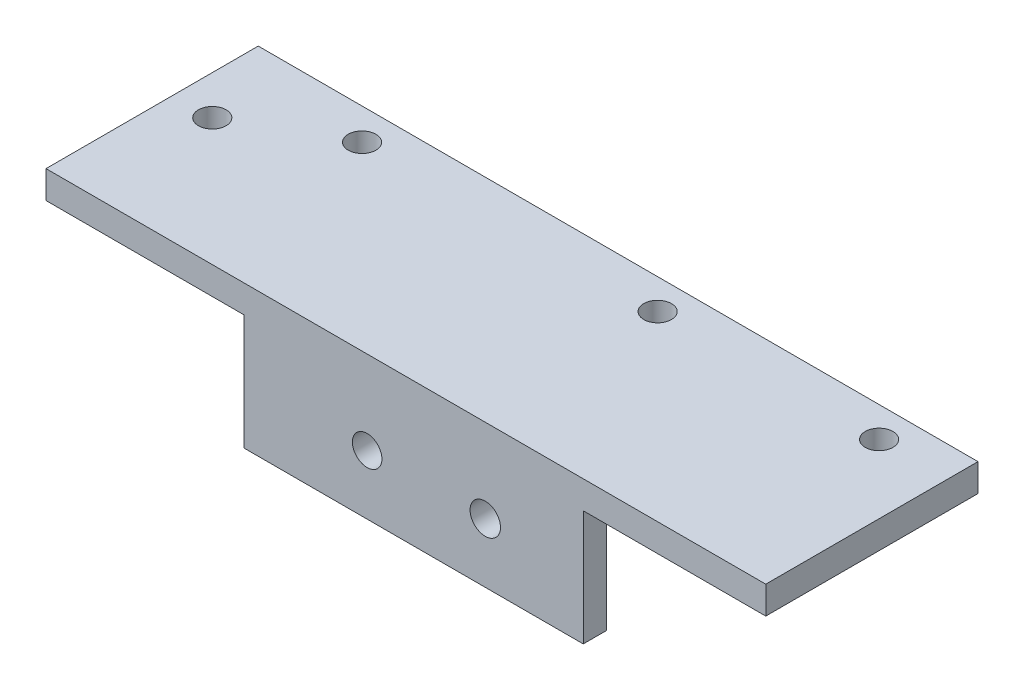
ISO-10303-21;
HEADER;
FILE_DESCRIPTION(('STEP AP214'),'2;1');
FILE_NAME('part.step','',(''),(''),'','','');
FILE_SCHEMA(('AUTOMOTIVE_DESIGN { 1 0 10303 214 1 1 1 1 }'));
ENDSEC;
DATA;
#1=APPLICATION_CONTEXT('core data for automotive mechanical design processes');
#2=APPLICATION_PROTOCOL_DEFINITION('international standard','automotive_design',2000,#1);
#3=PRODUCT_CONTEXT('',#1,'mechanical');
#4=PRODUCT('Part','Part','',(#3));
#5=PRODUCT_RELATED_PRODUCT_CATEGORY('part','',(#4));
#6=PRODUCT_DEFINITION_FORMATION('','',#4);
#7=PRODUCT_DEFINITION_CONTEXT('part definition',#1,'design');
#8=PRODUCT_DEFINITION('design','',#6,#7);
#9=PRODUCT_DEFINITION_SHAPE('','',#8);
#10=(LENGTH_UNIT() NAMED_UNIT(*) SI_UNIT(.MILLI.,.METRE.));
#11=(NAMED_UNIT(*) PLANE_ANGLE_UNIT() SI_UNIT($,.RADIAN.));
#12=(NAMED_UNIT(*) SI_UNIT($,.STERADIAN.) SOLID_ANGLE_UNIT());
#13=UNCERTAINTY_MEASURE_WITH_UNIT(LENGTH_MEASURE(1.E-05),#10,'distance_accuracy_value','');
#14=(GEOMETRIC_REPRESENTATION_CONTEXT(3) GLOBAL_UNCERTAINTY_ASSIGNED_CONTEXT((#13)) GLOBAL_UNIT_ASSIGNED_CONTEXT((#10,
#11,#12)) REPRESENTATION_CONTEXT('',''));
#15=CARTESIAN_POINT('',(0.,0.,0.));
#16=DIRECTION('',(0.,0.,1.));
#17=DIRECTION('',(1.,0.,0.));
#18=AXIS2_PLACEMENT_3D('',#15,#16,#17);
#19=CARTESIAN_POINT('',(0.,0.,0.));
#20=DIRECTION('',(0.,1.,0.));
#21=DIRECTION('',(0.,0.,1.));
#22=AXIS2_PLACEMENT_3D('',#19,#20,#21);
#23=PLANE('',#22);
#24=CARTESIAN_POINT('',(-24.35,0.,-4.1));
#25=DIRECTION('',(0.,1.,0.));
#26=DIRECTION('',(0.,0.,1.));
#27=AXIS2_PLACEMENT_3D('',#24,#25,#26);
#28=CIRCLE('',#27,1.5);
#29=CARTESIAN_POINT('',(-24.35,0.,-2.6));
#30=VERTEX_POINT('',#29);
#31=EDGE_CURVE('E178',#30,#30,#28,.T.);
#32=ORIENTED_EDGE('',*,*,#31,.T.);
#33=EDGE_LOOP('',(#32));
#34=FACE_BOUND('',#33,.T.);
#35=CARTESIAN_POINT('',(31.56,0.,-4.22169208076263));
#36=DIRECTION('',(0.,1.,0.));
#37=DIRECTION('',(0.,0.,1.));
#38=AXIS2_PLACEMENT_3D('',#35,#36,#37);
#39=CIRCLE('',#38,1.5);
#40=CARTESIAN_POINT('',(31.56,0.,-2.72169208076263));
#41=VERTEX_POINT('',#40);
#42=EDGE_CURVE('E171',#41,#41,#39,.T.);
#43=ORIENTED_EDGE('',*,*,#42,.T.);
#44=EDGE_LOOP('',(#43));
#45=FACE_BOUND('',#44,.T.);
#46=CARTESIAN_POINT('',(7.56,0.,-4.22169208076263));
#47=DIRECTION('',(0.,1.,0.));
#48=DIRECTION('',(0.,0.,1.));
#49=AXIS2_PLACEMENT_3D('',#46,#47,#48);
#50=CIRCLE('',#49,1.5);
#51=CARTESIAN_POINT('',(7.56,0.,-2.72169208076263));
#52=VERTEX_POINT('',#51);
#53=EDGE_CURVE('E153',#52,#52,#50,.T.);
#54=ORIENTED_EDGE('',*,*,#53,.T.);
#55=EDGE_LOOP('',(#54));
#56=FACE_BOUND('',#55,.T.);
#57=CARTESIAN_POINT('',(-34.76,0.,1.72));
#58=DIRECTION('',(0.,1.,0.));
#59=DIRECTION('',(0.,0.,1.));
#60=AXIS2_PLACEMENT_3D('',#57,#58,#59);
#61=CIRCLE('',#60,1.5);
#62=CARTESIAN_POINT('',(-34.76,0.,3.22));
#63=VERTEX_POINT('',#62);
#64=EDGE_CURVE('E157',#63,#63,#61,.T.);
#65=ORIENTED_EDGE('',*,*,#64,.T.);
#66=EDGE_LOOP('',(#65));
#67=FACE_BOUND('',#66,.T.);
#68=DIRECTION('',(0.,0.,-1.));
#69=VECTOR('',#68,1.);
#70=CARTESIAN_POINT('',(-17.5447148574661,0.,15.5));
#71=LINE('',#70,#69);
#72=CARTESIAN_POINT('',(-17.5447148574661,0.,15.5));
#73=VERTEX_POINT('',#72);
#74=CARTESIAN_POINT('',(-17.5447148574661,0.,13.));
#75=VERTEX_POINT('',#74);
#76=EDGE_CURVE('E66',#73,#75,#71,.T.);
#77=ORIENTED_EDGE('',*,*,#76,.F.);
#78=DIRECTION('',(-1.,0.,0.));
#79=VECTOR('',#78,1.);
#80=CARTESIAN_POINT('',(-39.,0.,15.5));
#81=LINE('',#80,#79);
#82=CARTESIAN_POINT('',(-39.,0.,15.5));
#83=VERTEX_POINT('',#82);
#84=EDGE_CURVE('E133',#73,#83,#81,.T.);
#85=ORIENTED_EDGE('',*,*,#84,.T.);
#86=DIRECTION('',(0.,0.,-1.));
#87=VECTOR('',#86,1.);
#88=CARTESIAN_POINT('',(-39.,0.,7.5));
#89=LINE('',#88,#87);
#90=CARTESIAN_POINT('',(-39.,0.,-7.5));
#91=VERTEX_POINT('',#90);
#92=EDGE_CURVE('E193',#83,#91,#89,.T.);
#93=ORIENTED_EDGE('',*,*,#92,.T.);
#94=DIRECTION('',(1.,0.,0.));
#95=VECTOR('',#94,1.);
#96=CARTESIAN_POINT('',(-39.,0.,-7.5));
#97=LINE('',#96,#95);
#98=CARTESIAN_POINT('',(39.,0.,-7.5));
#99=VERTEX_POINT('',#98);
#100=EDGE_CURVE('E161',#91,#99,#97,.T.);
#101=ORIENTED_EDGE('',*,*,#100,.T.);
#102=DIRECTION('',(0.,0.,-1.));
#103=VECTOR('',#102,1.);
#104=CARTESIAN_POINT('',(39.,0.,7.5));
#105=LINE('',#104,#103);
#106=CARTESIAN_POINT('',(39.,0.,15.5));
#107=VERTEX_POINT('',#106);
#108=EDGE_CURVE('E204',#107,#99,#105,.T.);
#109=ORIENTED_EDGE('',*,*,#108,.F.);
#110=CARTESIAN_POINT('',(19.2231892448185,0.,15.5));
#111=VERTEX_POINT('',#110);
#112=EDGE_CURVE('E137',#107,#111,#81,.T.);
#113=ORIENTED_EDGE('',*,*,#112,.T.);
#114=DIRECTION('',(0.,0.,1.));
#115=VECTOR('',#114,1.);
#116=CARTESIAN_POINT('',(19.2231892448185,0.,15.5));
#117=LINE('',#116,#115);
#118=CARTESIAN_POINT('',(19.2231892448185,0.,13.));
#119=VERTEX_POINT('',#118);
#120=EDGE_CURVE('E129',#119,#111,#117,.T.);
#121=ORIENTED_EDGE('',*,*,#120,.F.);
#122=DIRECTION('',(1.,0.,0.));
#123=VECTOR('',#122,1.);
#124=CARTESIAN_POINT('',(-17.5447148574661,0.,13.));
#125=LINE('',#124,#123);
#126=EDGE_CURVE('E61',#75,#119,#125,.T.);
#127=ORIENTED_EDGE('',*,*,#126,.F.);
#128=EDGE_LOOP('',(#77,#85,#93,#101,#109,#113,#121,#127));
#129=FACE_BOUND('',#128,.T.);
#130=ADVANCED_FACE('F45',(#34,#45,#56,#67,#129),#23,.F.);
#131=CARTESIAN_POINT('',(-39.,3.,-7.5));
#132=DIRECTION('',(0.,0.,-1.));
#133=DIRECTION('',(-1.,0.,0.));
#134=AXIS2_PLACEMENT_3D('',#131,#132,#133);
#135=PLANE('',#134);
#136=ORIENTED_EDGE('',*,*,#100,.F.);
#137=DIRECTION('',(0.,-1.,0.));
#138=VECTOR('',#137,1.);
#139=CARTESIAN_POINT('',(-39.,3.,-7.5));
#140=LINE('',#139,#138);
#141=CARTESIAN_POINT('',(-39.,3.,-7.5));
#142=VERTEX_POINT('',#141);
#143=EDGE_CURVE('E11',#142,#91,#140,.T.);
#144=ORIENTED_EDGE('',*,*,#143,.F.);
#145=DIRECTION('',(1.,0.,0.));
#146=VECTOR('',#145,1.);
#147=CARTESIAN_POINT('',(-39.,3.,-7.5));
#148=LINE('',#147,#146);
#149=CARTESIAN_POINT('',(39.,3.,-7.5));
#150=VERTEX_POINT('',#149);
#151=EDGE_CURVE('E189',#142,#150,#148,.T.);
#152=ORIENTED_EDGE('',*,*,#151,.T.);
#153=DIRECTION('',(0.,-1.,0.));
#154=VECTOR('',#153,1.);
#155=CARTESIAN_POINT('',(39.,3.,-7.5));
#156=LINE('',#155,#154);
#157=EDGE_CURVE('E49',#150,#99,#156,.T.);
#158=ORIENTED_EDGE('',*,*,#157,.T.);
#159=EDGE_LOOP('',(#136,#144,#152,#158));
#160=FACE_BOUND('',#159,.T.);
#161=ADVANCED_FACE('F47',(#160),#135,.T.);
#162=CARTESIAN_POINT('',(-39.,3.,7.5));
#163=DIRECTION('',(-1.,0.,0.));
#164=DIRECTION('',(0.,0.,1.));
#165=AXIS2_PLACEMENT_3D('',#162,#163,#164);
#166=PLANE('',#165);
#167=ORIENTED_EDGE('',*,*,#92,.F.);
#168=DIRECTION('',(0.,-1.,0.));
#169=VECTOR('',#168,1.);
#170=CARTESIAN_POINT('',(-39.,3.,15.5));
#171=LINE('',#170,#169);
#172=CARTESIAN_POINT('',(-39.,3.,15.5));
#173=VERTEX_POINT('',#172);
#174=EDGE_CURVE('E149',#173,#83,#171,.T.);
#175=ORIENTED_EDGE('',*,*,#174,.F.);
#176=DIRECTION('',(0.,0.,-1.));
#177=VECTOR('',#176,1.);
#178=CARTESIAN_POINT('',(-39.,3.,7.5));
#179=LINE('',#178,#177);
#180=EDGE_CURVE('E197',#173,#142,#179,.T.);
#181=ORIENTED_EDGE('',*,*,#180,.T.);
#182=ORIENTED_EDGE('',*,*,#143,.T.);
#183=EDGE_LOOP('',(#167,#175,#181,#182));
#184=FACE_BOUND('',#183,.T.);
#185=ADVANCED_FACE('F214',(#184),#166,.T.);
#186=CARTESIAN_POINT('',(39.,3.,7.5));
#187=DIRECTION('',(-1.,0.,0.));
#188=DIRECTION('',(0.,0.,1.));
#189=AXIS2_PLACEMENT_3D('',#186,#187,#188);
#190=PLANE('',#189);
#191=ORIENTED_EDGE('',*,*,#108,.T.);
#192=ORIENTED_EDGE('',*,*,#157,.F.);
#193=DIRECTION('',(0.,0.,-1.));
#194=VECTOR('',#193,1.);
#195=CARTESIAN_POINT('',(39.,3.,7.5));
#196=LINE('',#195,#194);
#197=CARTESIAN_POINT('',(39.,3.,15.5));
#198=VERTEX_POINT('',#197);
#199=EDGE_CURVE('E192',#198,#150,#196,.T.);
#200=ORIENTED_EDGE('',*,*,#199,.F.);
#201=DIRECTION('',(0.,-1.,0.));
#202=VECTOR('',#201,1.);
#203=CARTESIAN_POINT('',(39.,3.,15.5));
#204=LINE('',#203,#202);
#205=EDGE_CURVE('E146',#198,#107,#204,.T.);
#206=ORIENTED_EDGE('',*,*,#205,.T.);
#207=EDGE_LOOP('',(#191,#192,#200,#206));
#208=FACE_BOUND('',#207,.T.);
#209=ADVANCED_FACE('F228',(#208),#190,.F.);
#210=CARTESIAN_POINT('',(0.,3.,0.));
#211=DIRECTION('',(0.,1.,0.));
#212=DIRECTION('',(0.,0.,1.));
#213=AXIS2_PLACEMENT_3D('',#210,#211,#212);
#214=PLANE('',#213);
#215=CARTESIAN_POINT('',(7.56,3.,-4.22169208076263));
#216=DIRECTION('',(0.,1.,0.));
#217=DIRECTION('',(0.,0.,1.));
#218=AXIS2_PLACEMENT_3D('',#215,#216,#217);
#219=CIRCLE('',#218,1.5);
#220=CARTESIAN_POINT('',(7.56,3.,-2.72169208076263));
#221=VERTEX_POINT('',#220);
#222=EDGE_CURVE('E167',#221,#221,#219,.T.);
#223=ORIENTED_EDGE('',*,*,#222,.F.);
#224=EDGE_LOOP('',(#223));
#225=FACE_BOUND('',#224,.T.);
#226=ORIENTED_EDGE('',*,*,#180,.F.);
#227=DIRECTION('',(-1.,0.,0.));
#228=VECTOR('',#227,1.);
#229=CARTESIAN_POINT('',(-39.,3.,15.5));
#230=LINE('',#229,#228);
#231=EDGE_CURVE('E143',#198,#173,#230,.T.);
#232=ORIENTED_EDGE('',*,*,#231,.F.);
#233=ORIENTED_EDGE('',*,*,#199,.T.);
#234=ORIENTED_EDGE('',*,*,#151,.F.);
#235=EDGE_LOOP('',(#226,#232,#233,#234));
#236=FACE_BOUND('',#235,.T.);
#237=CARTESIAN_POINT('',(-34.76,3.,1.72));
#238=DIRECTION('',(0.,1.,0.));
#239=DIRECTION('',(0.,0.,1.));
#240=AXIS2_PLACEMENT_3D('',#237,#238,#239);
#241=CIRCLE('',#240,1.5);
#242=CARTESIAN_POINT('',(-34.76,3.,3.22));
#243=VERTEX_POINT('',#242);
#244=EDGE_CURVE('E162',#243,#243,#241,.T.);
#245=ORIENTED_EDGE('',*,*,#244,.F.);
#246=EDGE_LOOP('',(#245));
#247=FACE_BOUND('',#246,.T.);
#248=CARTESIAN_POINT('',(-24.35,3.,-4.1));
#249=DIRECTION('',(0.,1.,0.));
#250=DIRECTION('',(0.,0.,1.));
#251=AXIS2_PLACEMENT_3D('',#248,#249,#250);
#252=CIRCLE('',#251,1.5);
#253=CARTESIAN_POINT('',(-24.35,3.,-2.6));
#254=VERTEX_POINT('',#253);
#255=EDGE_CURVE('E166',#254,#254,#252,.T.);
#256=ORIENTED_EDGE('',*,*,#255,.F.);
#257=EDGE_LOOP('',(#256));
#258=FACE_BOUND('',#257,.T.);
#259=CARTESIAN_POINT('',(31.56,3.,-4.22169208076263));
#260=DIRECTION('',(0.,1.,0.));
#261=DIRECTION('',(0.,0.,1.));
#262=AXIS2_PLACEMENT_3D('',#259,#260,#261);
#263=CIRCLE('',#262,1.5);
#264=CARTESIAN_POINT('',(31.56,3.,-2.72169208076263));
#265=VERTEX_POINT('',#264);
#266=EDGE_CURVE('E182',#265,#265,#263,.T.);
#267=ORIENTED_EDGE('',*,*,#266,.F.);
#268=EDGE_LOOP('',(#267));
#269=FACE_BOUND('',#268,.T.);
#270=ADVANCED_FACE('F221',(#225,#236,#247,#258,#269),#214,.T.);
#271=CARTESIAN_POINT('',(-24.35,0.,-4.1));
#272=DIRECTION('',(0.,1.,0.));
#273=DIRECTION('',(0.,0.,1.));
#274=AXIS2_PLACEMENT_3D('',#271,#272,#273);
#275=CYLINDRICAL_SURFACE('',#274,1.5);
#276=ORIENTED_EDGE('',*,*,#31,.F.);
#277=EDGE_LOOP('',(#276));
#278=FACE_BOUND('',#277,.T.);
#279=ORIENTED_EDGE('',*,*,#255,.T.);
#280=EDGE_LOOP('',(#279));
#281=FACE_BOUND('',#280,.T.);
#282=ADVANCED_FACE('F304',(#278,#281),#275,.F.);
#283=CARTESIAN_POINT('',(31.56,0.,-4.22169208076263));
#284=DIRECTION('',(0.,1.,0.));
#285=DIRECTION('',(0.,0.,1.));
#286=AXIS2_PLACEMENT_3D('',#283,#284,#285);
#287=CYLINDRICAL_SURFACE('',#286,1.5);
#288=ORIENTED_EDGE('',*,*,#42,.F.);
#289=EDGE_LOOP('',(#288));
#290=FACE_BOUND('',#289,.T.);
#291=ORIENTED_EDGE('',*,*,#266,.T.);
#292=EDGE_LOOP('',(#291));
#293=FACE_BOUND('',#292,.T.);
#294=ADVANCED_FACE('F309',(#290,#293),#287,.F.);
#295=CARTESIAN_POINT('',(7.56,0.,-4.22169208076263));
#296=DIRECTION('',(0.,1.,0.));
#297=DIRECTION('',(0.,0.,1.));
#298=AXIS2_PLACEMENT_3D('',#295,#296,#297);
#299=CYLINDRICAL_SURFACE('',#298,1.5);
#300=ORIENTED_EDGE('',*,*,#53,.F.);
#301=EDGE_LOOP('',(#300));
#302=FACE_BOUND('',#301,.T.);
#303=ORIENTED_EDGE('',*,*,#222,.T.);
#304=EDGE_LOOP('',(#303));
#305=FACE_BOUND('',#304,.T.);
#306=ADVANCED_FACE('F314',(#302,#305),#299,.F.);
#307=CARTESIAN_POINT('',(-34.76,0.,1.72));
#308=DIRECTION('',(0.,1.,0.));
#309=DIRECTION('',(0.,0.,1.));
#310=AXIS2_PLACEMENT_3D('',#307,#308,#309);
#311=CYLINDRICAL_SURFACE('',#310,1.5);
#312=ORIENTED_EDGE('',*,*,#64,.F.);
#313=EDGE_LOOP('',(#312));
#314=FACE_BOUND('',#313,.T.);
#315=ORIENTED_EDGE('',*,*,#244,.T.);
#316=EDGE_LOOP('',(#315));
#317=FACE_BOUND('',#316,.T.);
#318=ADVANCED_FACE('F316',(#314,#317),#311,.F.);
#319=CARTESIAN_POINT('',(-39.,3.,15.5));
#320=DIRECTION('',(0.,0.,1.));
#321=DIRECTION('',(1.,0.,0.));
#322=AXIS2_PLACEMENT_3D('',#319,#320,#321);
#323=PLANE('',#322);
#324=CARTESIAN_POINT('',(-4.19681075518145,-6.05592298042477,15.5));
#325=DIRECTION('',(0.,0.,-1.));
#326=DIRECTION('',(-1.,0.,0.));
#327=AXIS2_PLACEMENT_3D('',#324,#325,#326);
#328=CIRCLE('',#327,1.6);
#329=CARTESIAN_POINT('',(-5.79681075518145,-6.05592298042477,15.5));
#330=VERTEX_POINT('',#329);
#331=EDGE_CURVE('E257',#330,#330,#328,.T.);
#332=ORIENTED_EDGE('',*,*,#331,.T.);
#333=EDGE_LOOP('',(#332));
#334=FACE_BOUND('',#333,.T.);
#335=CARTESIAN_POINT('',(8.60318924481855,-6.05592298042477,15.5));
#336=DIRECTION('',(0.,0.,1.));
#337=DIRECTION('',(1.,0.,0.));
#338=AXIS2_PLACEMENT_3D('',#335,#336,#337);
#339=CIRCLE('',#338,1.65);
#340=CARTESIAN_POINT('',(10.2531892448186,-6.05592298042477,15.5));
#341=VERTEX_POINT('',#340);
#342=EDGE_CURVE('E245',#341,#341,#339,.T.);
#343=ORIENTED_EDGE('',*,*,#342,.F.);
#344=EDGE_LOOP('',(#343));
#345=FACE_BOUND('',#344,.T.);
#346=ORIENTED_EDGE('',*,*,#112,.F.);
#347=ORIENTED_EDGE('',*,*,#205,.F.);
#348=ORIENTED_EDGE('',*,*,#231,.T.);
#349=ORIENTED_EDGE('',*,*,#174,.T.);
#350=ORIENTED_EDGE('',*,*,#84,.F.);
#351=DIRECTION('',(0.,1.,0.));
#352=VECTOR('',#351,1.);
#353=CARTESIAN_POINT('',(-17.5447148574661,-12.5,15.5));
#354=LINE('',#353,#352);
#355=CARTESIAN_POINT('',(-17.5447148574661,-12.5,15.5));
#356=VERTEX_POINT('',#355);
#357=EDGE_CURVE('E237',#356,#73,#354,.T.);
#358=ORIENTED_EDGE('',*,*,#357,.F.);
#359=DIRECTION('',(-1.,0.,0.));
#360=VECTOR('',#359,1.);
#361=CARTESIAN_POINT('',(-17.5447148574661,-12.5,15.5));
#362=LINE('',#361,#360);
#363=CARTESIAN_POINT('',(19.2231892448185,-12.5,15.5));
#364=VERTEX_POINT('',#363);
#365=EDGE_CURVE('E124',#364,#356,#362,.T.);
#366=ORIENTED_EDGE('',*,*,#365,.F.);
#367=DIRECTION('',(0.,1.,0.));
#368=VECTOR('',#367,1.);
#369=CARTESIAN_POINT('',(19.2231892448185,-12.5,15.5));
#370=LINE('',#369,#368);
#371=EDGE_CURVE('E139',#364,#111,#370,.T.);
#372=ORIENTED_EDGE('',*,*,#371,.T.);
#373=EDGE_LOOP('',(#346,#347,#348,#349,#350,#358,#366,#372));
#374=FACE_BOUND('',#373,.T.);
#375=ADVANCED_FACE('F217',(#334,#345,#374),#323,.T.);
#376=CARTESIAN_POINT('',(-17.5447148574661,-12.5,15.5));
#377=DIRECTION('',(1.,0.,0.));
#378=DIRECTION('',(0.,0.,-1.));
#379=AXIS2_PLACEMENT_3D('',#376,#377,#378);
#380=PLANE('',#379);
#381=ORIENTED_EDGE('',*,*,#76,.T.);
#382=DIRECTION('',(0.,1.,0.));
#383=VECTOR('',#382,1.);
#384=CARTESIAN_POINT('',(-17.5447148574661,-12.5,13.));
#385=LINE('',#384,#383);
#386=CARTESIAN_POINT('',(-17.5447148574661,-12.5,13.));
#387=VERTEX_POINT('',#386);
#388=EDGE_CURVE('E112',#387,#75,#385,.T.);
#389=ORIENTED_EDGE('',*,*,#388,.F.);
#390=DIRECTION('',(0.,0.,-1.));
#391=VECTOR('',#390,1.);
#392=CARTESIAN_POINT('',(-17.5447148574661,-12.5,15.5));
#393=LINE('',#392,#391);
#394=EDGE_CURVE('E119',#356,#387,#393,.T.);
#395=ORIENTED_EDGE('',*,*,#394,.F.);
#396=ORIENTED_EDGE('',*,*,#357,.T.);
#397=EDGE_LOOP('',(#381,#389,#395,#396));
#398=FACE_BOUND('',#397,.T.);
#399=ADVANCED_FACE('F131',(#398),#380,.F.);
#400=CARTESIAN_POINT('',(-17.5447148574661,-12.5,13.));
#401=DIRECTION('',(0.,0.,1.));
#402=DIRECTION('',(1.,0.,0.));
#403=AXIS2_PLACEMENT_3D('',#400,#401,#402);
#404=PLANE('',#403);
#405=CARTESIAN_POINT('',(-4.19681075518145,-6.05592298042477,13.));
#406=DIRECTION('',(0.,0.,-1.));
#407=DIRECTION('',(-1.,0.,0.));
#408=AXIS2_PLACEMENT_3D('',#405,#406,#407);
#409=CIRCLE('',#408,1.6);
#410=CARTESIAN_POINT('',(-5.79681075518145,-6.05592298042477,13.));
#411=VERTEX_POINT('',#410);
#412=EDGE_CURVE('E258',#411,#411,#409,.T.);
#413=ORIENTED_EDGE('',*,*,#412,.F.);
#414=EDGE_LOOP('',(#413));
#415=FACE_BOUND('',#414,.T.);
#416=CARTESIAN_POINT('',(8.60318924481855,-6.05592298042477,13.));
#417=DIRECTION('',(0.,0.,-1.));
#418=DIRECTION('',(-1.,0.,0.));
#419=AXIS2_PLACEMENT_3D('',#416,#417,#418);
#420=CIRCLE('',#419,1.65);
#421=CARTESIAN_POINT('',(6.95318924481855,-6.05592298042477,13.));
#422=VERTEX_POINT('',#421);
#423=EDGE_CURVE('E253',#422,#422,#420,.T.);
#424=ORIENTED_EDGE('',*,*,#423,.F.);
#425=EDGE_LOOP('',(#424));
#426=FACE_BOUND('',#425,.T.);
#427=ORIENTED_EDGE('',*,*,#126,.T.);
#428=DIRECTION('',(0.,1.,0.));
#429=VECTOR('',#428,1.);
#430=CARTESIAN_POINT('',(19.2231892448185,-12.5,13.));
#431=LINE('',#430,#429);
#432=CARTESIAN_POINT('',(19.2231892448185,-12.5,13.));
#433=VERTEX_POINT('',#432);
#434=EDGE_CURVE('E114',#433,#119,#431,.T.);
#435=ORIENTED_EDGE('',*,*,#434,.F.);
#436=DIRECTION('',(1.,0.,0.));
#437=VECTOR('',#436,1.);
#438=CARTESIAN_POINT('',(-17.5447148574661,-12.5,13.));
#439=LINE('',#438,#437);
#440=EDGE_CURVE('E108',#387,#433,#439,.T.);
#441=ORIENTED_EDGE('',*,*,#440,.F.);
#442=ORIENTED_EDGE('',*,*,#388,.T.);
#443=EDGE_LOOP('',(#427,#435,#441,#442));
#444=FACE_BOUND('',#443,.T.);
#445=ADVANCED_FACE('F110',(#415,#426,#444),#404,.F.);
#446=CARTESIAN_POINT('',(19.2231892448185,-12.5,15.5));
#447=DIRECTION('',(-1.,0.,0.));
#448=DIRECTION('',(0.,0.,1.));
#449=AXIS2_PLACEMENT_3D('',#446,#447,#448);
#450=PLANE('',#449);
#451=ORIENTED_EDGE('',*,*,#120,.T.);
#452=ORIENTED_EDGE('',*,*,#371,.F.);
#453=DIRECTION('',(0.,0.,1.));
#454=VECTOR('',#453,1.);
#455=CARTESIAN_POINT('',(19.2231892448185,-12.5,15.5));
#456=LINE('',#455,#454);
#457=EDGE_CURVE('E118',#433,#364,#456,.T.);
#458=ORIENTED_EDGE('',*,*,#457,.F.);
#459=ORIENTED_EDGE('',*,*,#434,.T.);
#460=EDGE_LOOP('',(#451,#452,#458,#459));
#461=FACE_BOUND('',#460,.T.);
#462=ADVANCED_FACE('F233',(#461),#450,.F.);
#463=CARTESIAN_POINT('',(0.,-12.5,0.));
#464=DIRECTION('',(0.,-1.,0.));
#465=DIRECTION('',(0.,0.,-1.));
#466=AXIS2_PLACEMENT_3D('',#463,#464,#465);
#467=PLANE('',#466);
#468=ORIENTED_EDGE('',*,*,#394,.T.);
#469=ORIENTED_EDGE('',*,*,#440,.T.);
#470=ORIENTED_EDGE('',*,*,#457,.T.);
#471=ORIENTED_EDGE('',*,*,#365,.T.);
#472=EDGE_LOOP('',(#468,#469,#470,#471));
#473=FACE_BOUND('',#472,.T.);
#474=ADVANCED_FACE('F122',(#473),#467,.T.);
#475=CARTESIAN_POINT('',(8.60318924481855,-6.05592298042477,25.5));
#476=DIRECTION('',(0.,0.,-1.));
#477=DIRECTION('',(-1.,0.,0.));
#478=AXIS2_PLACEMENT_3D('',#475,#476,#477);
#479=CYLINDRICAL_SURFACE('',#478,1.65);
#480=ORIENTED_EDGE('',*,*,#342,.T.);
#481=EDGE_LOOP('',(#480));
#482=FACE_BOUND('',#481,.T.);
#483=ORIENTED_EDGE('',*,*,#423,.T.);
#484=EDGE_LOOP('',(#483));
#485=FACE_BOUND('',#484,.T.);
#486=ADVANCED_FACE('F271',(#482,#485),#479,.F.);
#487=CARTESIAN_POINT('',(-4.19681075518145,-6.05592298042477,15.5));
#488=DIRECTION('',(0.,0.,-1.));
#489=DIRECTION('',(-1.,0.,0.));
#490=AXIS2_PLACEMENT_3D('',#487,#488,#489);
#491=CYLINDRICAL_SURFACE('',#490,1.6);
#492=ORIENTED_EDGE('',*,*,#331,.F.);
#493=EDGE_LOOP('',(#492));
#494=FACE_BOUND('',#493,.T.);
#495=ORIENTED_EDGE('',*,*,#412,.T.);
#496=EDGE_LOOP('',(#495));
#497=FACE_BOUND('',#496,.T.);
#498=ADVANCED_FACE('F268',(#494,#497),#491,.F.);
#499=CLOSED_SHELL('',(#130,#161,#185,#209,#270,#282,#294,#306,#318,#375,#399,#445,#462,#474,
#486,#498));
#500=MANIFOLD_SOLID_BREP('B2',#499);
#501=ADVANCED_BREP_SHAPE_REPRESENTATION('',(#18,#500),#14);
#502=SHAPE_DEFINITION_REPRESENTATION(#9,#501);
ENDSEC;
END-ISO-10303-21;
